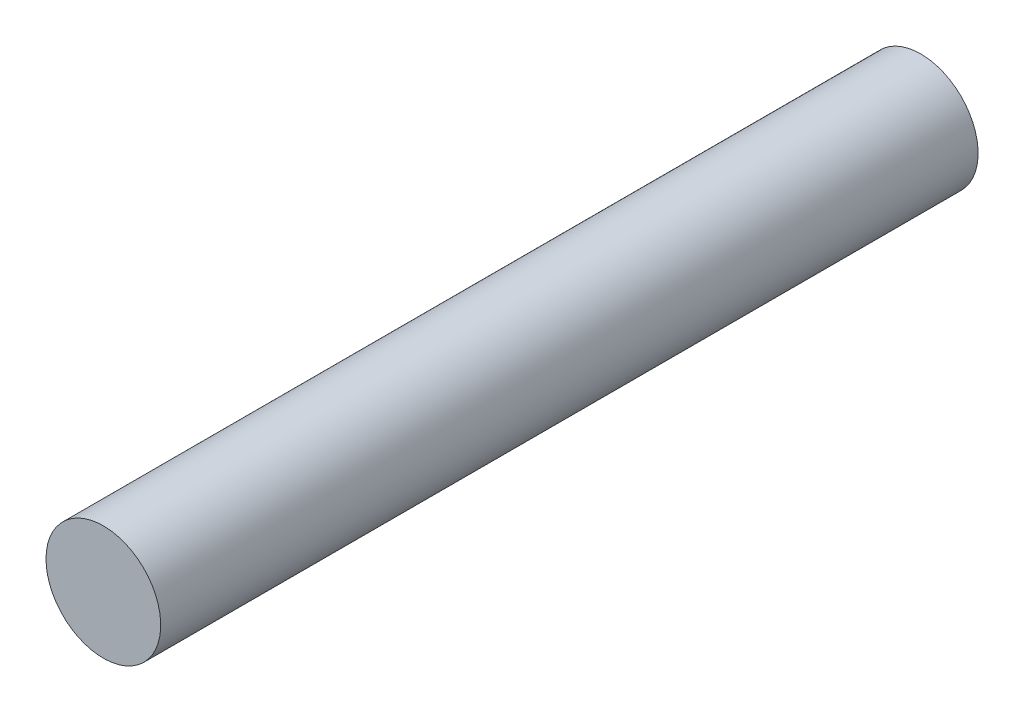
ISO-10303-21;
HEADER;
FILE_DESCRIPTION(('STEP AP214'),'2;1');
FILE_NAME('part.step','',(''),(''),'','','');
FILE_SCHEMA(('AUTOMOTIVE_DESIGN { 1 0 10303 214 1 1 1 1 }'));
ENDSEC;
DATA;
#1=APPLICATION_CONTEXT('core data for automotive mechanical design processes');
#2=APPLICATION_PROTOCOL_DEFINITION('international standard','automotive_design',2000,#1);
#3=PRODUCT_CONTEXT('',#1,'mechanical');
#4=PRODUCT('Part','Part','',(#3));
#5=PRODUCT_RELATED_PRODUCT_CATEGORY('part','',(#4));
#6=PRODUCT_DEFINITION_FORMATION('','',#4);
#7=PRODUCT_DEFINITION_CONTEXT('part definition',#1,'design');
#8=PRODUCT_DEFINITION('design','',#6,#7);
#9=PRODUCT_DEFINITION_SHAPE('','',#8);
#10=(LENGTH_UNIT() NAMED_UNIT(*) SI_UNIT(.MILLI.,.METRE.));
#11=(NAMED_UNIT(*) PLANE_ANGLE_UNIT() SI_UNIT($,.RADIAN.));
#12=(NAMED_UNIT(*) SI_UNIT($,.STERADIAN.) SOLID_ANGLE_UNIT());
#13=UNCERTAINTY_MEASURE_WITH_UNIT(LENGTH_MEASURE(1.E-05),#10,'distance_accuracy_value','');
#14=(GEOMETRIC_REPRESENTATION_CONTEXT(3) GLOBAL_UNCERTAINTY_ASSIGNED_CONTEXT((#13)) GLOBAL_UNIT_ASSIGNED_CONTEXT((#10,
#11,#12)) REPRESENTATION_CONTEXT('',''));
#15=CARTESIAN_POINT('',(0.,0.,0.));
#16=DIRECTION('',(0.,0.,1.));
#17=DIRECTION('',(1.,0.,0.));
#18=AXIS2_PLACEMENT_3D('',#15,#16,#17);
#19=CARTESIAN_POINT('',(0.,0.,57.));
#20=DIRECTION('',(0.,0.,-1.));
#21=DIRECTION('',(-1.,0.,0.));
#22=AXIS2_PLACEMENT_3D('',#19,#20,#21);
#23=CYLINDRICAL_SURFACE('',#22,4.);
#24=CARTESIAN_POINT('',(0.,0.,57.));
#25=DIRECTION('',(0.,0.,1.));
#26=DIRECTION('',(1.,0.,0.));
#27=AXIS2_PLACEMENT_3D('',#24,#25,#26);
#28=CIRCLE('',#27,4.);
#29=CARTESIAN_POINT('',(-4.,0.,57.));
#30=VERTEX_POINT('',#29);
#31=EDGE_CURVE('E10',#30,#30,#28,.T.);
#32=CARTESIAN_POINT('',(0.,0.,0.));
#33=DIRECTION('',(0.,0.,1.));
#34=DIRECTION('',(1.,0.,0.));
#35=AXIS2_PLACEMENT_3D('',#32,#33,#34);
#36=CIRCLE('',#35,4.);
#37=CARTESIAN_POINT('',(-4.,0.,0.));
#38=VERTEX_POINT('',#37);
#39=EDGE_CURVE('E35',#38,#38,#36,.T.);
#40=CARTESIAN_POINT('',(-4.,0.,57.));
#41=CARTESIAN_POINT('',(-4.,0.,56.40625));
#42=CARTESIAN_POINT('',(-4.,0.,55.8125));
#43=CARTESIAN_POINT('',(-4.,0.,54.625));
#44=CARTESIAN_POINT('',(-4.,0.,54.03125));
#45=CARTESIAN_POINT('',(-4.,0.,52.84375));
#46=CARTESIAN_POINT('',(-4.,0.,52.25));
#47=CARTESIAN_POINT('',(-4.,0.,51.0625));
#48=CARTESIAN_POINT('',(-4.,0.,50.46875));
#49=CARTESIAN_POINT('',(-4.,0.,49.28125));
#50=CARTESIAN_POINT('',(-4.,0.,48.6875));
#51=CARTESIAN_POINT('',(-4.,0.,47.5));
#52=CARTESIAN_POINT('',(-4.,0.,46.90625));
#53=CARTESIAN_POINT('',(-4.,0.,45.71875));
#54=CARTESIAN_POINT('',(-4.,0.,45.125));
#55=CARTESIAN_POINT('',(-4.,0.,43.9375));
#56=CARTESIAN_POINT('',(-4.,0.,43.34375));
#57=CARTESIAN_POINT('',(-4.,0.,42.15625));
#58=CARTESIAN_POINT('',(-4.,0.,41.5625));
#59=CARTESIAN_POINT('',(-4.,0.,40.375));
#60=CARTESIAN_POINT('',(-4.,0.,39.78125));
#61=CARTESIAN_POINT('',(-4.,0.,38.59375));
#62=CARTESIAN_POINT('',(-4.,0.,38.));
#63=CARTESIAN_POINT('',(-4.,0.,36.8125));
#64=CARTESIAN_POINT('',(-4.,0.,36.21875));
#65=CARTESIAN_POINT('',(-4.,0.,35.03125));
#66=CARTESIAN_POINT('',(-4.,0.,34.4375));
#67=CARTESIAN_POINT('',(-4.,0.,33.25));
#68=CARTESIAN_POINT('',(-4.,0.,32.65625));
#69=CARTESIAN_POINT('',(-4.,0.,31.46875));
#70=CARTESIAN_POINT('',(-4.,0.,30.875));
#71=CARTESIAN_POINT('',(-4.,0.,29.6875));
#72=CARTESIAN_POINT('',(-4.,0.,29.09375));
#73=CARTESIAN_POINT('',(-4.,0.,27.90625));
#74=CARTESIAN_POINT('',(-4.,0.,27.3125));
#75=CARTESIAN_POINT('',(-4.,0.,26.125));
#76=CARTESIAN_POINT('',(-4.,0.,25.53125));
#77=CARTESIAN_POINT('',(-4.,0.,24.34375));
#78=CARTESIAN_POINT('',(-4.,0.,23.75));
#79=CARTESIAN_POINT('',(-4.,0.,22.5625));
#80=CARTESIAN_POINT('',(-4.,0.,21.96875));
#81=CARTESIAN_POINT('',(-4.,0.,20.78125));
#82=CARTESIAN_POINT('',(-4.,0.,20.1875));
#83=CARTESIAN_POINT('',(-4.,0.,19.));
#84=CARTESIAN_POINT('',(-4.,0.,18.40625));
#85=CARTESIAN_POINT('',(-4.,0.,17.21875));
#86=CARTESIAN_POINT('',(-4.,0.,16.625));
#87=CARTESIAN_POINT('',(-4.,0.,15.4375));
#88=CARTESIAN_POINT('',(-4.,0.,14.84375));
#89=CARTESIAN_POINT('',(-4.,0.,13.65625));
#90=CARTESIAN_POINT('',(-4.,0.,13.0625));
#91=CARTESIAN_POINT('',(-4.,0.,11.875));
#92=CARTESIAN_POINT('',(-4.,0.,11.28125));
#93=CARTESIAN_POINT('',(-4.,0.,10.09375));
#94=CARTESIAN_POINT('',(-4.,0.,9.5));
#95=CARTESIAN_POINT('',(-4.,0.,8.3125));
#96=CARTESIAN_POINT('',(-4.,0.,7.71875));
#97=CARTESIAN_POINT('',(-4.,0.,6.53125));
#98=CARTESIAN_POINT('',(-4.,0.,5.9375));
#99=CARTESIAN_POINT('',(-4.,0.,4.75));
#100=CARTESIAN_POINT('',(-4.,0.,4.15625));
#101=CARTESIAN_POINT('',(-4.,0.,2.96875));
#102=CARTESIAN_POINT('',(-4.,0.,2.375));
#103=CARTESIAN_POINT('',(-4.,0.,1.1875));
#104=CARTESIAN_POINT('',(-4.,0.,0.593749999999999));
#105=CARTESIAN_POINT('',(-4.,0.,0.));
#106=B_SPLINE_CURVE_WITH_KNOTS('',3,(#40,#41,#42,#43,#44,#45,#46,#47,#48,#49,#50,#51,#52,#53,
#54,#55,#56,#57,#58,#59,#60,#61,#62,#63,#64,#65,#66,#67,#68,#69,#70,#71,#72,#73,#74,#75,#76,#77,
#78,#79,#80,#81,#82,#83,#84,#85,#86,#87,#88,#89,#90,#91,#92,#93,#94,#95,#96,#97,#98,#99,#100,
#101,#102,#103,#104,#105),.UNSPECIFIED.,.F.,.F.,(4,2,2,2,2,2,2,2,2,2,2,2,2,2,2,2,2,2,2,2,2,2,2,
2,2,2,2,2,2,2,2,2,4),(0.,1.78125000000001,3.5625,5.34375,7.12500000000001,8.90625,10.6875,
12.46875,14.25,16.03125,17.8125,19.59375,21.375,23.15625,24.9375,26.71875,28.5,30.28125,32.0625,
33.84375,35.625,37.40625,39.1875,40.96875,42.75,44.53125,46.3125,48.09375,49.875,51.65625,
53.4375,55.21875,57.),.UNSPECIFIED.);
#107=EDGE_CURVE('BSEAM32',#30,#38,#106,.T.);
#108=ORIENTED_EDGE('',*,*,#31,.F.);
#109=ORIENTED_EDGE('',*,*,#39,.T.);
#110=ORIENTED_EDGE('',*,*,#107,.T.);
#111=ORIENTED_EDGE('',*,*,#107,.F.);
#112=EDGE_LOOP('',(#108,#110,#109,#111));
#113=FACE_BOUND('',#112,.T.);
#114=ADVANCED_FACE('F32',(#113),#23,.T.);
#115=CARTESIAN_POINT('',(0.,0.,57.));
#116=DIRECTION('',(0.,0.,1.));
#117=DIRECTION('',(1.,0.,0.));
#118=AXIS2_PLACEMENT_3D('',#115,#116,#117);
#119=PLANE('',#118);
#120=ORIENTED_EDGE('',*,*,#31,.T.);
#121=EDGE_LOOP('',(#120));
#122=FACE_BOUND('',#121,.T.);
#123=ADVANCED_FACE('F47',(#122),#119,.T.);
#124=CARTESIAN_POINT('',(0.,0.,0.));
#125=DIRECTION('',(0.,0.,1.));
#126=DIRECTION('',(1.,0.,0.));
#127=AXIS2_PLACEMENT_3D('',#124,#125,#126);
#128=PLANE('',#127);
#129=ORIENTED_EDGE('',*,*,#39,.F.);
#130=EDGE_LOOP('',(#129));
#131=FACE_BOUND('',#130,.T.);
#132=ADVANCED_FACE('F45',(#131),#128,.F.);
#133=CLOSED_SHELL('',(#114,#123,#132));
#134=MANIFOLD_SOLID_BREP('B2',#133);
#135=ADVANCED_BREP_SHAPE_REPRESENTATION('',(#18,#134),#14);
#136=SHAPE_DEFINITION_REPRESENTATION(#9,#135);
ENDSEC;
END-ISO-10303-21;
